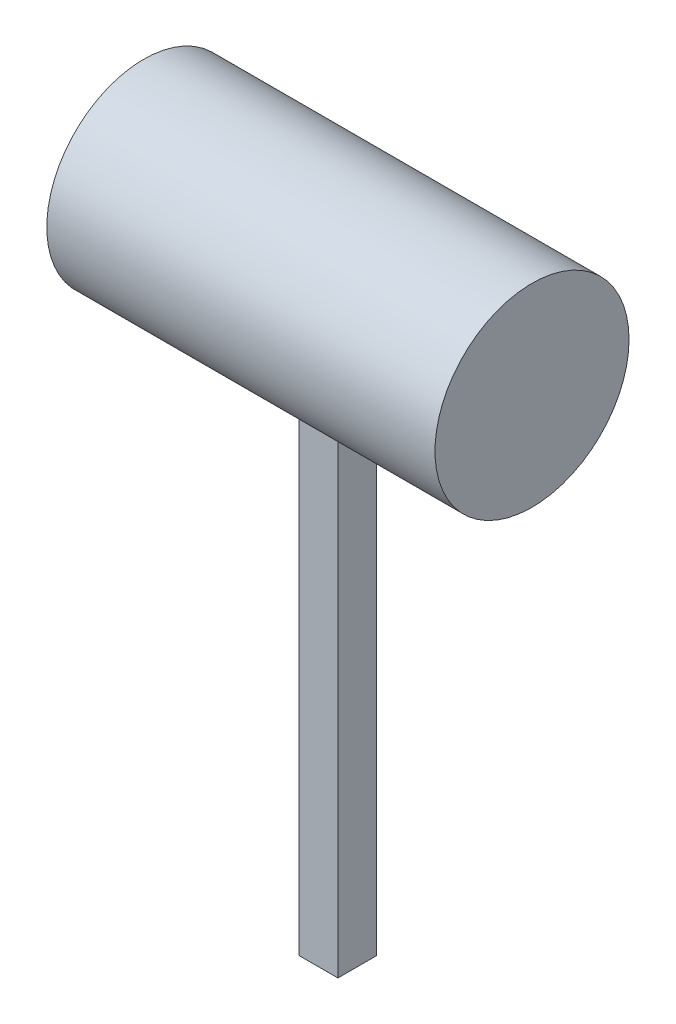
ISO-10303-21;
HEADER;
FILE_DESCRIPTION(('STEP AP214'),'2;1');
FILE_NAME('part.step','',(''),(''),'','','');
FILE_SCHEMA(('AUTOMOTIVE_DESIGN { 1 0 10303 214 1 1 1 1 }'));
ENDSEC;
DATA;
#1=APPLICATION_CONTEXT('core data for automotive mechanical design processes');
#2=APPLICATION_PROTOCOL_DEFINITION('international standard','automotive_design',2000,#1);
#3=PRODUCT_CONTEXT('',#1,'mechanical');
#4=PRODUCT('Part','Part','',(#3));
#5=PRODUCT_RELATED_PRODUCT_CATEGORY('part','',(#4));
#6=PRODUCT_DEFINITION_FORMATION('','',#4);
#7=PRODUCT_DEFINITION_CONTEXT('part definition',#1,'design');
#8=PRODUCT_DEFINITION('design','',#6,#7);
#9=PRODUCT_DEFINITION_SHAPE('','',#8);
#10=(LENGTH_UNIT() NAMED_UNIT(*) SI_UNIT(.MILLI.,.METRE.));
#11=(NAMED_UNIT(*) PLANE_ANGLE_UNIT() SI_UNIT($,.RADIAN.));
#12=(NAMED_UNIT(*) SI_UNIT($,.STERADIAN.) SOLID_ANGLE_UNIT());
#13=UNCERTAINTY_MEASURE_WITH_UNIT(LENGTH_MEASURE(1.E-05),#10,'distance_accuracy_value','');
#14=(GEOMETRIC_REPRESENTATION_CONTEXT(3) GLOBAL_UNCERTAINTY_ASSIGNED_CONTEXT((#13)) GLOBAL_UNIT_ASSIGNED_CONTEXT((#10,
#11,#12)) REPRESENTATION_CONTEXT('',''));
#15=CARTESIAN_POINT('',(0.,0.,0.));
#16=DIRECTION('',(0.,0.,1.));
#17=DIRECTION('',(1.,0.,0.));
#18=AXIS2_PLACEMENT_3D('',#15,#16,#17);
#19=CARTESIAN_POINT('',(10.,0.,0.));
#20=DIRECTION('',(-1.,0.,0.));
#21=DIRECTION('',(0.,0.,1.));
#22=AXIS2_PLACEMENT_3D('',#19,#20,#21);
#23=CYLINDRICAL_SURFACE('',#22,5.);
#24=CARTESIAN_POINT('',(-0.999999999999999,0.,0.));
#25=DIRECTION('',(1.,0.,0.));
#26=DIRECTION('',(0.,1.,0.));
#27=AXIS2_PLACEMENT_3D('',#24,#25,#26);
#28=CIRCLE('',#27,5.);
#29=CARTESIAN_POINT('',(-0.999999999999999,-4.89897948556636,1.));
#30=VERTEX_POINT('',#29);
#31=CARTESIAN_POINT('',(-1.,-4.89897948556636,-1.));
#32=VERTEX_POINT('',#31);
#33=EDGE_CURVE('E40',#30,#32,#28,.T.);
#34=ORIENTED_EDGE('',*,*,#33,.F.);
#35=DIRECTION('',(-1.,0.,0.));
#36=VECTOR('',#35,1.);
#37=CARTESIAN_POINT('',(10.,-4.89897948556636,1.));
#38=LINE('',#37,#36);
#39=CARTESIAN_POINT('',(1.,-4.89897948556636,1.));
#40=VERTEX_POINT('',#39);
#41=EDGE_CURVE('E11',#30,#40,#38,.F.);
#42=ORIENTED_EDGE('',*,*,#41,.T.);
#43=CARTESIAN_POINT('',(0.999999999999999,0.,0.));
#44=DIRECTION('',(-1.,0.,0.));
#45=DIRECTION('',(0.,-1.,0.));
#46=AXIS2_PLACEMENT_3D('',#43,#44,#45);
#47=CIRCLE('',#46,5.);
#48=CARTESIAN_POINT('',(1.,-4.89897948556636,-1.));
#49=VERTEX_POINT('',#48);
#50=EDGE_CURVE('E103',#49,#40,#47,.T.);
#51=ORIENTED_EDGE('',*,*,#50,.F.);
#52=DIRECTION('',(-1.,0.,0.));
#53=VECTOR('',#52,1.);
#54=CARTESIAN_POINT('',(10.,-4.89897948556636,-1.));
#55=LINE('',#54,#53);
#56=EDGE_CURVE('E99',#32,#49,#55,.F.);
#57=ORIENTED_EDGE('',*,*,#56,.F.);
#58=EDGE_LOOP('',(#34,#42,#51,#57));
#59=FACE_BOUND('',#58,.T.);
#60=CARTESIAN_POINT('',(10.,0.,0.));
#61=DIRECTION('',(1.,0.,0.));
#62=DIRECTION('',(0.,0.,-1.));
#63=AXIS2_PLACEMENT_3D('',#60,#61,#62);
#64=CIRCLE('',#63,5.);
#65=CARTESIAN_POINT('',(10.,0.,-5.));
#66=VERTEX_POINT('',#65);
#67=EDGE_CURVE('E93',#66,#66,#64,.T.);
#68=ORIENTED_EDGE('',*,*,#67,.F.);
#69=EDGE_LOOP('',(#68));
#70=FACE_BOUND('',#69,.T.);
#71=CARTESIAN_POINT('',(-10.,0.,0.));
#72=DIRECTION('',(1.,0.,0.));
#73=DIRECTION('',(0.,0.,-1.));
#74=AXIS2_PLACEMENT_3D('',#71,#72,#73);
#75=CIRCLE('',#74,5.);
#76=CARTESIAN_POINT('',(-10.,0.,-5.));
#77=VERTEX_POINT('',#76);
#78=EDGE_CURVE('E90',#77,#77,#75,.T.);
#79=ORIENTED_EDGE('',*,*,#78,.T.);
#80=EDGE_LOOP('',(#79));
#81=FACE_BOUND('',#80,.T.);
#82=ADVANCED_FACE('F33',(#59,#70,#81),#23,.T.);
#83=CARTESIAN_POINT('',(10.,0.,0.));
#84=DIRECTION('',(1.,0.,0.));
#85=DIRECTION('',(0.,0.,-1.));
#86=AXIS2_PLACEMENT_3D('',#83,#84,#85);
#87=PLANE('',#86);
#88=ORIENTED_EDGE('',*,*,#67,.T.);
#89=EDGE_LOOP('',(#88));
#90=FACE_BOUND('',#89,.T.);
#91=ADVANCED_FACE('F116',(#90),#87,.T.);
#92=CARTESIAN_POINT('',(-10.,0.,0.));
#93=DIRECTION('',(1.,0.,0.));
#94=DIRECTION('',(0.,0.,-1.));
#95=AXIS2_PLACEMENT_3D('',#92,#93,#94);
#96=PLANE('',#95);
#97=ORIENTED_EDGE('',*,*,#78,.F.);
#98=EDGE_LOOP('',(#97));
#99=FACE_BOUND('',#98,.T.);
#100=ADVANCED_FACE('F121',(#99),#96,.F.);
#101=CARTESIAN_POINT('',(0.,0.,1.));
#102=DIRECTION('',(0.,0.,1.));
#103=DIRECTION('',(1.,0.,0.));
#104=AXIS2_PLACEMENT_3D('',#101,#102,#103);
#105=PLANE('',#104);
#106=ORIENTED_EDGE('',*,*,#41,.F.);
#107=DIRECTION('',(0.,-1.,0.));
#108=VECTOR('',#107,1.);
#109=CARTESIAN_POINT('',(-1.,0.,1.));
#110=LINE('',#109,#108);
#111=CARTESIAN_POINT('',(-0.999999999999996,-30.,1.));
#112=VERTEX_POINT('',#111);
#113=EDGE_CURVE('E67',#30,#112,#110,.T.);
#114=ORIENTED_EDGE('',*,*,#113,.T.);
#115=DIRECTION('',(1.,0.,0.));
#116=VECTOR('',#115,1.);
#117=CARTESIAN_POINT('',(-0.999999999999996,-30.,1.));
#118=LINE('',#117,#116);
#119=CARTESIAN_POINT('',(1.00000000000001,-30.,1.));
#120=VERTEX_POINT('',#119);
#121=EDGE_CURVE('E71',#112,#120,#118,.T.);
#122=ORIENTED_EDGE('',*,*,#121,.T.);
#123=DIRECTION('',(0.,1.,0.));
#124=VECTOR('',#123,1.);
#125=CARTESIAN_POINT('',(1.,0.,1.));
#126=LINE('',#125,#124);
#127=EDGE_CURVE('E84',#120,#40,#126,.T.);
#128=ORIENTED_EDGE('',*,*,#127,.T.);
#129=EDGE_LOOP('',(#106,#114,#122,#128));
#130=FACE_BOUND('',#129,.T.);
#131=ADVANCED_FACE('F69',(#130),#105,.T.);
#132=CARTESIAN_POINT('',(0.,0.,-1.));
#133=DIRECTION('',(0.,0.,1.));
#134=DIRECTION('',(1.,0.,0.));
#135=AXIS2_PLACEMENT_3D('',#132,#133,#134);
#136=PLANE('',#135);
#137=DIRECTION('',(0.,-1.,0.));
#138=VECTOR('',#137,1.);
#139=CARTESIAN_POINT('',(-1.,0.,-1.));
#140=LINE('',#139,#138);
#141=CARTESIAN_POINT('',(-0.999999999999996,-30.,-1.));
#142=VERTEX_POINT('',#141);
#143=EDGE_CURVE('E88',#32,#142,#140,.T.);
#144=ORIENTED_EDGE('',*,*,#143,.F.);
#145=ORIENTED_EDGE('',*,*,#56,.T.);
#146=DIRECTION('',(0.,1.,0.));
#147=VECTOR('',#146,1.);
#148=CARTESIAN_POINT('',(1.,0.,-1.));
#149=LINE('',#148,#147);
#150=CARTESIAN_POINT('',(1.00000000000001,-30.,-1.));
#151=VERTEX_POINT('',#150);
#152=EDGE_CURVE('E75',#151,#49,#149,.T.);
#153=ORIENTED_EDGE('',*,*,#152,.F.);
#154=DIRECTION('',(1.,0.,0.));
#155=VECTOR('',#154,1.);
#156=CARTESIAN_POINT('',(-0.999999999999996,-30.,-1.));
#157=LINE('',#156,#155);
#158=EDGE_CURVE('E108',#142,#151,#157,.T.);
#159=ORIENTED_EDGE('',*,*,#158,.F.);
#160=EDGE_LOOP('',(#144,#145,#153,#159));
#161=FACE_BOUND('',#160,.T.);
#162=ADVANCED_FACE('F105',(#161),#136,.F.);
#163=CARTESIAN_POINT('',(-1.,0.,1.));
#164=DIRECTION('',(1.,0.,0.));
#165=DIRECTION('',(0.,1.,0.));
#166=AXIS2_PLACEMENT_3D('',#163,#164,#165);
#167=PLANE('',#166);
#168=ORIENTED_EDGE('',*,*,#113,.F.);
#169=ORIENTED_EDGE('',*,*,#33,.T.);
#170=ORIENTED_EDGE('',*,*,#143,.T.);
#171=DIRECTION('',(0.,0.,-1.));
#172=VECTOR('',#171,1.);
#173=CARTESIAN_POINT('',(-0.999999999999996,-30.,1.));
#174=LINE('',#173,#172);
#175=EDGE_CURVE('E80',#112,#142,#174,.T.);
#176=ORIENTED_EDGE('',*,*,#175,.F.);
#177=EDGE_LOOP('',(#168,#169,#170,#176));
#178=FACE_BOUND('',#177,.T.);
#179=ADVANCED_FACE('F86',(#178),#167,.F.);
#180=CARTESIAN_POINT('',(-0.999999999999996,-30.,1.));
#181=DIRECTION('',(0.,1.,0.));
#182=DIRECTION('',(0.,0.,1.));
#183=AXIS2_PLACEMENT_3D('',#180,#181,#182);
#184=PLANE('',#183);
#185=ORIENTED_EDGE('',*,*,#158,.T.);
#186=DIRECTION('',(0.,0.,-1.));
#187=VECTOR('',#186,1.);
#188=CARTESIAN_POINT('',(1.00000000000001,-30.,1.));
#189=LINE('',#188,#187);
#190=EDGE_CURVE('E82',#120,#151,#189,.T.);
#191=ORIENTED_EDGE('',*,*,#190,.F.);
#192=ORIENTED_EDGE('',*,*,#121,.F.);
#193=ORIENTED_EDGE('',*,*,#175,.T.);
#194=EDGE_LOOP('',(#185,#191,#192,#193));
#195=FACE_BOUND('',#194,.T.);
#196=ADVANCED_FACE('F79',(#195),#184,.F.);
#197=CARTESIAN_POINT('',(1.,0.,1.));
#198=DIRECTION('',(-1.,0.,0.));
#199=DIRECTION('',(0.,-1.,0.));
#200=AXIS2_PLACEMENT_3D('',#197,#198,#199);
#201=PLANE('',#200);
#202=ORIENTED_EDGE('',*,*,#152,.T.);
#203=ORIENTED_EDGE('',*,*,#50,.T.);
#204=ORIENTED_EDGE('',*,*,#127,.F.);
#205=ORIENTED_EDGE('',*,*,#190,.T.);
#206=EDGE_LOOP('',(#202,#203,#204,#205));
#207=FACE_BOUND('',#206,.T.);
#208=ADVANCED_FACE('F113',(#207),#201,.F.);
#209=CLOSED_SHELL('',(#82,#91,#100,#131,#162,#179,#196,#208));
#210=MANIFOLD_SOLID_BREP('B2',#209);
#211=ADVANCED_BREP_SHAPE_REPRESENTATION('',(#18,#210),#14);
#212=SHAPE_DEFINITION_REPRESENTATION(#9,#211);
ENDSEC;
END-ISO-10303-21;
